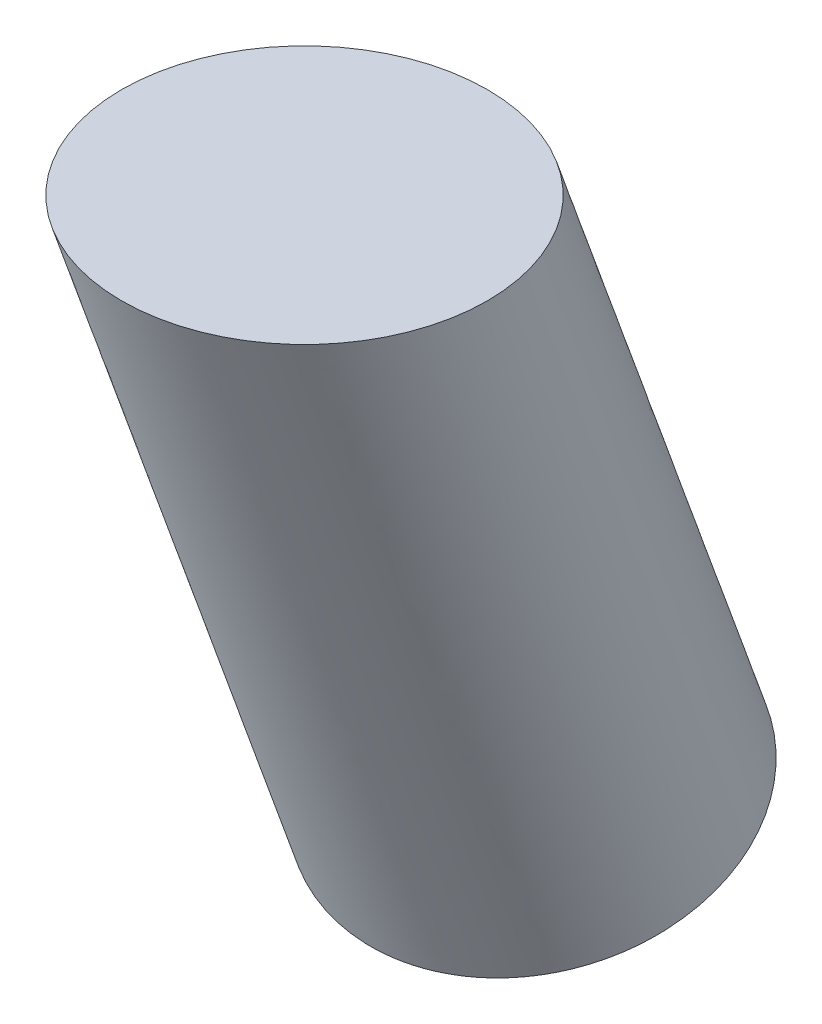
ISO-10303-21;
HEADER;
FILE_DESCRIPTION(('STEP AP214'),'2;1');
FILE_NAME('part.step','',(''),(''),'','','');
FILE_SCHEMA(('AUTOMOTIVE_DESIGN { 1 0 10303 214 1 1 1 1 }'));
ENDSEC;
DATA;
#1=APPLICATION_CONTEXT('core data for automotive mechanical design processes');
#2=APPLICATION_PROTOCOL_DEFINITION('international standard','automotive_design',2000,#1);
#3=PRODUCT_CONTEXT('',#1,'mechanical');
#4=PRODUCT('Part','Part','',(#3));
#5=PRODUCT_RELATED_PRODUCT_CATEGORY('part','',(#4));
#6=PRODUCT_DEFINITION_FORMATION('','',#4);
#7=PRODUCT_DEFINITION_CONTEXT('part definition',#1,'design');
#8=PRODUCT_DEFINITION('design','',#6,#7);
#9=PRODUCT_DEFINITION_SHAPE('','',#8);
#10=(LENGTH_UNIT() NAMED_UNIT(*) SI_UNIT(.MILLI.,.METRE.));
#11=(NAMED_UNIT(*) PLANE_ANGLE_UNIT() SI_UNIT($,.RADIAN.));
#12=(NAMED_UNIT(*) SI_UNIT($,.STERADIAN.) SOLID_ANGLE_UNIT());
#13=UNCERTAINTY_MEASURE_WITH_UNIT(LENGTH_MEASURE(1.E-05),#10,'distance_accuracy_value','');
#14=(GEOMETRIC_REPRESENTATION_CONTEXT(3) GLOBAL_UNCERTAINTY_ASSIGNED_CONTEXT((#13)) GLOBAL_UNIT_ASSIGNED_CONTEXT((#10,
#11,#12)) REPRESENTATION_CONTEXT('',''));
#15=CARTESIAN_POINT('',(0.,0.,0.));
#16=DIRECTION('',(0.,0.,1.));
#17=DIRECTION('',(1.,0.,0.));
#18=AXIS2_PLACEMENT_3D('',#15,#16,#17);
#19=CARTESIAN_POINT('',(76.9622776424513,-1026.07913519455,-144.059681538295));
#20=DIRECTION('',(0.,1.,0.));
#21=DIRECTION('',(-1.,0.,0.));
#22=AXIS2_PLACEMENT_3D('',#19,#20,#21);
#23=CIRCLE('',#22,37.);
#24=DIRECTION('',(0.,-0.939607059285867,-0.342255130188235));
#25=VECTOR('',#24,1.);
#26=SURFACE_OF_LINEAR_EXTRUSION('',#23,#25);
#27=CARTESIAN_POINT('',(39.9622776424512,-1026.07913519455,-144.059681538295));
#28=VERTEX_POINT('',#27);
#29=EDGE_CURVE('E53',#28,#28,#23,.T.);
#30=ORIENTED_EDGE('',*,*,#29,.F.);
#31=EDGE_LOOP('',(#30));
#32=FACE_BOUND('',#31,.T.);
#33=CARTESIAN_POINT('',(39.9622776424512,-1152.47817220577,-190.100969159976));
#34=CARTESIAN_POINT('',(39.9622773598002,-1152.32158281661,-190.530860438408));
#35=CARTESIAN_POINT('',(39.971891724759,-1152.16499252968,-190.960754181516));
#36=CARTESIAN_POINT('',(40.010332933896,-1151.85202860567,-191.819946889993));
#37=CARTESIAN_POINT('',(40.0391671674441,-1151.69565507511,-192.249245562942));
#38=CARTESIAN_POINT('',(40.1157560490168,-1151.38439961296,-193.103747960957));
#39=CARTESIAN_POINT('',(40.1633957731352,-1151.22951436854,-193.528960780877));
#40=CARTESIAN_POINT('',(40.2774863886854,-1150.92055278671,-194.377165695076));
#41=CARTESIAN_POINT('',(40.3439379488668,-1150.76647647826,-194.800157709862));
#42=CARTESIAN_POINT('',(40.4955124939043,-1150.45937476181,-195.643256659274));
#43=CARTESIAN_POINT('',(40.580638590195,-1150.30634953333,-196.063363101081));
#44=CARTESIAN_POINT('',(40.7693666581664,-1150.00161608599,-196.89996034408));
#45=CARTESIAN_POINT('',(40.8729724601477,-1149.84990814702,-197.316450376893));
#46=CARTESIAN_POINT('',(41.2110626635922,-1149.3973078772,-198.558992477951));
#47=CARTESIAN_POINT('',(41.4729099906482,-1149.09875690824,-199.378616709264));
#48=CARTESIAN_POINT('',(42.0672111457387,-1148.51000344579,-200.994945759429));
#49=CARTESIAN_POINT('',(42.3996673809968,-1148.21980123732,-201.791649795826));
#50=CARTESIAN_POINT('',(42.9490177003146,-1147.7921943042,-202.965576663598));
#51=CARTESIAN_POINT('',(43.1406023320465,-1147.65092648363,-203.353405010802));
#52=CARTESIAN_POINT('',(43.5402195730964,-1147.37118767675,-204.121383441246));
#53=CARTESIAN_POINT('',(43.7482480215251,-1147.23271599399,-204.501535436514));
#54=CARTESIAN_POINT('',(44.3964153319114,-1146.82177444644,-205.629710137125));
#55=CARTESIAN_POINT('',(44.8607196387716,-1146.55371320527,-206.365629667052));
#56=CARTESIAN_POINT('',(45.8495713487906,-1146.03117690296,-207.800170029129));
#57=CARTESIAN_POINT('',(46.3740898778655,-1145.77669541507,-208.498808504905));
#58=CARTESIAN_POINT('',(47.4799514529805,-1145.28234936768,-209.85595700287));
#59=CARTESIAN_POINT('',(48.0613337961958,-1145.04249510522,-210.514438756201));
#60=CARTESIAN_POINT('',(49.2829161788718,-1144.57632171364,-211.79424370561));
#61=CARTESIAN_POINT('',(49.9236850809779,-1144.35017732524,-212.415087178848));
#62=CARTESIAN_POINT('',(51.2542796583842,-1143.91530821165,-213.608951208806));
#63=CARTESIAN_POINT('',(51.944124250422,-1143.70659027178,-214.181953137487));
#64=CARTESIAN_POINT('',(53.3682120179188,-1143.30756273642,-215.277419811333));
#65=CARTESIAN_POINT('',(54.1024697102382,-1143.11725921328,-215.79986788582));
#66=CARTESIAN_POINT('',(55.6101788890948,-1142.75601703313,-216.791600872831));
#67=CARTESIAN_POINT('',(56.3836175723717,-1142.58507210859,-217.26090299185));
#68=CARTESIAN_POINT('',(58.0416139319838,-1142.24760493033,-218.187365490161));
#69=CARTESIAN_POINT('',(58.9296894161778,-1142.08310401108,-218.63897661692));
#70=CARTESIAN_POINT('',(60.7405177317638,-1141.77900810034,-219.473823604542));
#71=CARTESIAN_POINT('',(61.6632398985927,-1141.63939168545,-219.857118279902));
#72=CARTESIAN_POINT('',(63.5380821087037,-1141.38545552183,-220.554259654579));
#73=CARTESIAN_POINT('',(64.490206604809,-1141.27113962633,-220.868095775416));
#74=CARTESIAN_POINT('',(66.4178058406479,-1141.06826844458,-221.425046359034));
#75=CARTESIAN_POINT('',(67.393285522904,-1140.97971866414,-221.668145706443));
#76=CARTESIAN_POINT('',(69.3611567926076,-1140.82876396624,-222.082567835636));
#77=CARTESIAN_POINT('',(70.3535451372334,-1140.76635409299,-222.253904222735));
#78=CARTESIAN_POINT('',(72.3493607287534,-1140.66788685723,-222.524230367397));
#79=CARTESIAN_POINT('',(73.3527874151287,-1140.63182816283,-222.623223781427));
#80=CARTESIAN_POINT('',(75.3647441769293,-1140.58618779782,-222.748522149132));
#81=CARTESIAN_POINT('',(76.373274150836,-1140.57660560257,-222.774828543103));
#82=CARTESIAN_POINT('',(78.3895219077611,-1140.58395072884,-222.754663666436));
#83=CARTESIAN_POINT('',(79.3972396813024,-1140.60087835532,-222.708191558547));
#84=CARTESIAN_POINT('',(81.4059274704921,-1140.66118439248,-222.542630919028));
#85=CARTESIAN_POINT('',(82.406897310658,-1140.70456348838,-222.423540506242));
#86=CARTESIAN_POINT('',(84.3960866368778,-1140.81761655827,-222.113171272374));
#87=CARTESIAN_POINT('',(85.3843061547787,-1140.88729046657,-221.921892631635));
#88=CARTESIAN_POINT('',(87.3420817198655,-1141.05268325192,-221.467833028256));
#89=CARTESIAN_POINT('',(88.3116358696014,-1141.14840476205,-221.205044836898));
#90=CARTESIAN_POINT('',(90.2259060540322,-1141.36552018186,-220.60898896178));
#91=CARTESIAN_POINT('',(91.1706221075092,-1141.48691407213,-220.275721331319));
#92=CARTESIAN_POINT('',(93.0292387004357,-1141.75490377964,-219.539998185686));
#93=CARTESIAN_POINT('',(93.9431341285232,-1141.90150375277,-219.137531261185));
#94=CARTESIAN_POINT('',(95.7337562106525,-1142.21926110046,-218.265178969883));
#95=CARTESIAN_POINT('',(96.6104827810266,-1142.3904185303,-217.795293451332));
#96=CARTESIAN_POINT('',(98.3207274879757,-1142.75654520461,-216.790150861985));
#97=CARTESIAN_POINT('',(99.15423560645,-1142.95151993513,-216.254878730119));
#98=CARTESIAN_POINT('',(100.771572740079,-1143.36428720422,-215.121691801206));
#99=CARTESIAN_POINT('',(101.555402429853,-1143.58207943283,-214.523777855111));
#100=CARTESIAN_POINT('',(103.050714245338,-1144.0343435523,-213.282158601433));
#101=CARTESIAN_POINT('',(103.763399496719,-1144.26834938044,-212.639732794933));
#102=CARTESIAN_POINT('',(105.12956977243,-1144.75580755257,-211.301493863677));
#103=CARTESIAN_POINT('',(105.783056895075,-1145.0092592067,-210.605682632818));
#104=CARTESIAN_POINT('',(107.007073032715,-1145.52641194651,-209.185921985883));
#105=CARTESIAN_POINT('',(107.579471826837,-1145.7895950714,-208.463394548823));
#106=CARTESIAN_POINT('',(108.658518086372,-1146.3313609595,-206.976062415464));
#107=CARTESIAN_POINT('',(109.165167676669,-1146.60994322462,-206.211259086577));
#108=CARTESIAN_POINT('',(109.866415331607,-1147.03436831855,-205.046067452546));
#109=CARTESIAN_POINT('',(110.087884108502,-1147.17508273438,-204.659758390105));
#110=CARTESIAN_POINT('',(110.513649206464,-1147.45952153019,-203.878876887103));
#111=CARTESIAN_POINT('',(110.717946756613,-1147.60324569381,-203.484305040505));
#112=CARTESIAN_POINT('',(111.108889147187,-1147.89345799092,-202.687573307346));
#113=CARTESIAN_POINT('',(111.295536177611,-1148.0399457788,-202.285414369605));
#114=CARTESIAN_POINT('',(111.650827044383,-1148.33549166447,-201.474040116813));
#115=CARTESIAN_POINT('',(111.819466253354,-1148.48455041153,-201.06482301929));
#116=CARTESIAN_POINT('',(112.291753688652,-1148.92955646536,-199.843129631175));
#117=CARTESIAN_POINT('',(112.569156512424,-1149.22882226071,-199.021542957638));
#118=CARTESIAN_POINT('',(113.050336746121,-1149.83420549171,-197.359559521152));
#119=CARTESIAN_POINT('',(113.254116506783,-1150.14032270827,-196.519163359689));
#120=CARTESIAN_POINT('',(113.502334274417,-1150.60146069153,-195.253182323463));
#121=CARTESIAN_POINT('',(113.57527648636,-1150.75473651504,-194.832387912838));
#122=CARTESIAN_POINT('',(113.702499764015,-1151.06215463969,-193.988420315008));
#123=CARTESIAN_POINT('',(113.756785379329,-1151.21629672024,-193.565247733364));
#124=CARTESIAN_POINT('',(113.891456261716,-1151.67963730209,-192.293219812794));
#125=CARTESIAN_POINT('',(113.943706618821,-1151.98984497794,-191.44159394553));
#126=CARTESIAN_POINT('',(113.972558102186,-1152.61028852444,-189.738264806654));
#127=CARTESIAN_POINT('',(113.949252612374,-1152.92052388675,-188.88656293062));
#128=CARTESIAN_POINT('',(113.85790886255,-1153.38463476705,-187.612420278061));
#129=CARTESIAN_POINT('',(113.818028626833,-1153.53920985233,-187.18805895079));
#130=CARTESIAN_POINT('',(113.719543340784,-1153.84768527305,-186.341188714623));
#131=CARTESIAN_POINT('',(113.660935097598,-1154.00158548891,-185.918680134056));
#132=CARTESIAN_POINT('',(113.455401899699,-1154.46589240094,-184.643999307579));
#133=CARTESIAN_POINT('',(113.279561406419,-1154.7748581269,-183.79578301634));
#134=CARTESIAN_POINT('',(112.853043575805,-1155.38677544981,-182.115861269093));
#135=CARTESIAN_POINT('',(112.602332991008,-1155.68972431099,-181.284163323724));
#136=CARTESIAN_POINT('',(112.02840133534,-1156.28747132218,-179.643143914983));
#137=CARTESIAN_POINT('',(111.705180333592,-1156.58226947996,-178.833822430279));
#138=CARTESIAN_POINT('',(110.989271961252,-1157.16166281298,-177.243190127679));
#139=CARTESIAN_POINT('',(110.596612458341,-1157.44626202645,-176.461868223461));
#140=CARTESIAN_POINT('',(109.743743984349,-1158.00451796916,-174.929265266233));
#141=CARTESIAN_POINT('',(109.283319653017,-1158.27813613475,-174.178090083543));
#142=CARTESIAN_POINT('',(108.299844484128,-1158.81174498337,-172.713151805529));
#143=CARTESIAN_POINT('',(107.776809530023,-1159.07173909867,-171.999379287446));
#144=CARTESIAN_POINT('',(106.665599734388,-1159.57972183353,-170.604793431545));
#145=CARTESIAN_POINT('',(106.076723204676,-1159.82753056598,-169.924473945193));
#146=CARTESIAN_POINT('',(104.843341252199,-1160.30652408637,-168.609473369879));
#147=CARTESIAN_POINT('',(104.198813723929,-1160.53770220087,-167.974810601731));
#148=CARTESIAN_POINT('',(102.858705269408,-1160.98227939538,-166.754294578697));
#149=CARTESIAN_POINT('',(102.16309571705,-1161.19566836121,-166.168469090684));
#150=CARTESIAN_POINT('',(100.726287510142,-1161.60343388136,-165.049013668485));
#151=CARTESIAN_POINT('',(99.9851047922493,-1161.797817021,-164.515365655347));
#152=CARTESIAN_POINT('',(98.4125030819676,-1162.1787474886,-163.469581604543));
#153=CARTESIAN_POINT('',(97.5783486609051,-1162.36397297207,-162.961074480826));
#154=CARTESIAN_POINT('',(95.8704381407354,-1162.7109596171,-162.008477799593));
#155=CARTESIAN_POINT('',(94.9967184528033,-1162.87274179942,-161.564330532942));
#156=CARTESIAN_POINT('',(93.2146852213907,-1163.17237364414,-160.741738929044));
#157=CARTESIAN_POINT('',(92.3063634810596,-1163.3102175923,-160.363310279332));
#158=CARTESIAN_POINT('',(90.46118794384,-1163.56136310088,-159.673830204504));
#159=CARTESIAN_POINT('',(89.5243331124304,-1163.67466377023,-159.36278122569));
#160=CARTESIAN_POINT('',(87.6284558009812,-1163.87622418254,-158.809429151253));
#161=CARTESIAN_POINT('',(86.6694451376122,-1163.96449695509,-158.56709028495));
#162=CARTESIAN_POINT('',(84.7338510295521,-1164.1158091268,-158.151686768253));
#163=CARTESIAN_POINT('',(83.7572551898935,-1164.17882993635,-157.978673152635));
#164=CARTESIAN_POINT('',(81.7818701800528,-1164.27988500633,-157.70124252046));
#165=CARTESIAN_POINT('',(80.7829549390907,-1164.31763061537,-157.597617950418));
#166=CARTESIAN_POINT('',(78.7792396176416,-1164.36686779083,-157.462445111329));
#167=CARTESIAN_POINT('',(77.7744374317257,-1164.37834930635,-157.430924435441));
#168=CARTESIAN_POINT('',(75.7650740646754,-1164.37498784926,-157.440152781575));
#169=CARTESIAN_POINT('',(74.7605129309537,-1164.36014150158,-157.480911069347));
#170=CARTESIAN_POINT('',(72.7580360230659,-1164.30418207366,-157.634538784068));
#171=CARTESIAN_POINT('',(71.7601179793753,-1164.26307848416,-157.747382155732));
#172=CARTESIAN_POINT('',(69.6918141383377,-1164.1501355334,-158.057449075026));
#173=CARTESIAN_POINT('',(68.6225032411504,-1164.07597458685,-158.261046166073));
#174=CARTESIAN_POINT('',(66.5067096933679,-1163.8972887162,-158.75159982223));
#175=CARTESIAN_POINT('',(65.4602086282192,-1163.79278934051,-159.038486248259));
#176=CARTESIAN_POINT('',(63.4273052693182,-1163.55741409467,-159.684671573371));
#177=CARTESIAN_POINT('',(62.4400409377755,-1163.42741023515,-160.041576505888));
#178=CARTESIAN_POINT('',(60.5002280051593,-1163.13978940817,-160.831193769718));
#179=CARTESIAN_POINT('',(59.547685114804,-1162.9821679229,-161.263918503941));
#180=CARTESIAN_POINT('',(57.7090608389943,-1162.64456660365,-162.190749265014));
#181=CARTESIAN_POINT('',(56.8218922329878,-1162.46528037278,-162.682951114752));
#182=CARTESIAN_POINT('',(55.0941223797148,-1162.08213804274,-163.734807482297));
#183=CARTESIAN_POINT('',(54.2535167821113,-1161.87828424457,-164.294455683087));
#184=CARTESIAN_POINT('',(52.6497235793185,-1161.45349505121,-165.460646894238));
#185=CARTESIAN_POINT('',(51.8849751971207,-1161.23324994509,-166.06529482565));
#186=CARTESIAN_POINT('',(50.4114515876157,-1160.7717776666,-167.332193616293));
#187=CARTESIAN_POINT('',(49.7026786338775,-1160.53054964281,-167.994446812999));
#188=CARTESIAN_POINT('',(48.3673077255634,-1160.03599910653,-169.352156702716));
#189=CARTESIAN_POINT('',(47.7388875839658,-1159.78325308348,-170.046030735617));
#190=CARTESIAN_POINT('',(46.5457071232972,-1159.26086037192,-171.480176892113));
#191=CARTESIAN_POINT('',(45.9809259500603,-1158.99121926518,-172.220433691851));
#192=CARTESIAN_POINT('',(44.9342131655796,-1158.44418710187,-173.722223546741));
#193=CARTESIAN_POINT('',(44.4504336137363,-1158.16721164535,-174.482615638006));
#194=CARTESIAN_POINT('',(43.7762199913854,-1157.7420723258,-175.649768064945));
#195=CARTESIAN_POINT('',(43.5599344731471,-1157.59865032721,-176.043510365481));
#196=CARTESIAN_POINT('',(43.1450381357993,-1157.30881290498,-176.839212939253));
#197=CARTESIAN_POINT('',(42.9464302734444,-1157.16239698559,-177.241174573476));
#198=CARTESIAN_POINT('',(42.3806926722242,-1156.72123711888,-178.452308866199));
#199=CARTESIAN_POINT('',(42.0402268573089,-1156.42242358984,-179.272653914484));
#200=CARTESIAN_POINT('',(41.4340130192536,-1155.81591567683,-180.937724986637));
#201=CARTESIAN_POINT('',(41.1683011784772,-1155.5082170715,-181.782462599614));
#202=CARTESIAN_POINT('',(40.7145021522385,-1154.88649552146,-183.489300294054));
#203=CARTESIAN_POINT('',(40.5263412346131,-1154.57247888306,-184.351383062578));
#204=CARTESIAN_POINT('',(40.2292287531192,-1153.94025029214,-186.08706616772));
#205=CARTESIAN_POINT('',(40.1202240650924,-1153.62204129953,-186.96065837837));
#206=CARTESIAN_POINT('',(40.0216061550145,-1153.16565118729,-188.213604889387));
#207=CARTESIAN_POINT('',(39.9993548399127,-1153.02821846085,-188.59090459521));
#208=CARTESIAN_POINT('',(39.9696956085288,-1152.75324803612,-189.345792190419));
#209=CARTESIAN_POINT('',(39.9622778907139,-1152.61571046725,-189.723379724479));
#210=CARTESIAN_POINT('',(39.9622776424512,-1152.47817220577,-190.100969159976));
#211=B_SPLINE_CURVE_WITH_KNOTS('',3,(#33,#34,#35,#36,#37,#38,#39,#40,#41,#42,#43,#44,#45,#46,
#47,#48,#49,#50,#51,#52,#53,#54,#55,#56,#57,#58,#59,#60,#61,#62,#63,#64,#65,#66,#67,#68,#69,#70,
#71,#72,#73,#74,#75,#76,#77,#78,#79,#80,#81,#82,#83,#84,#85,#86,#87,#88,#89,#90,#91,#92,#93,#94,
#95,#96,#97,#98,#99,#100,#101,#102,#103,#104,#105,#106,#107,#108,#109,#110,#111,#112,#113,#114,
#115,#116,#117,#118,#119,#120,#121,#122,#123,#124,#125,#126,#127,#128,#129,#130,#131,#132,#133,
#134,#135,#136,#137,#138,#139,#140,#141,#142,#143,#144,#145,#146,#147,#148,#149,#150,#151,#152,
#153,#154,#155,#156,#157,#158,#159,#160,#161,#162,#163,#164,#165,#166,#167,#168,#169,#170,#171,
#172,#173,#174,#175,#176,#177,#178,#179,#180,#181,#182,#183,#184,#185,#186,#187,#188,#189,#190,
#191,#192,#193,#194,#195,#196,#197,#198,#199,#200,#201,#202,#203,#204,#205,#206,#207,#208,#209,
#210),.UNSPECIFIED.,.T.,.F.,(4,2,2,2,2,2,2,2,2,2,2,2,2,2,2,2,2,2,2,2,2,2,2,2,2,2,2,2,2,2,2,2,2,
2,2,2,2,2,2,2,2,2,2,2,2,2,2,2,2,2,2,2,2,2,2,2,2,2,2,2,2,2,2,2,2,2,2,2,2,2,2,2,2,2,2,2,2,2,2,2,2,
2,2,2,2,2,2,2,4),(0.,1.37247087810684,2.74546972803802,4.11020468926403,5.4749881721129,
6.83999921960911,8.20529352330754,10.9342675053411,13.663334539448,15.0281641828451,
16.3926495730206,19.1210007954939,21.8480491340011,24.5769955660465,27.3354998347922,
30.0950732201092,32.8555535251816,35.6151375285592,38.6412178749279,41.6646803127138,
44.6886029049643,47.7131711897564,50.7371657962753,53.7610075489298,56.7847893836217,
59.8086060044614,62.8325009597062,65.8563883605683,68.8805815521406,71.9047724567947,
74.9294624580807,77.954159267619,80.9795541003529,84.004907840211,86.9644311365147,
89.9238494895463,92.7965490173788,95.6691556821467,97.0698146402841,98.4703732565973,
99.870757869158,101.271501469778,104.020188633782,106.768788026229,108.129673293939,
109.490226459886,112.210490205178,114.927393098441,116.287231755667,117.64730236953,
120.402887011935,123.159697147418,125.916504654943,128.672208276324,131.436866744997,
134.200825338357,136.99770601741,139.795702820561,142.595279751637,145.39388319506,
148.373654852007,151.35073790026,154.328530626996,157.306431448051,160.282779106899,
163.261313838907,166.27330932844,169.286457274074,172.299991515949,175.312437126232,
178.581704346184,181.848226418135,185.018088707721,188.188470021082,191.275827037428,
194.362895116761,197.357944578513,200.353115628488,203.258820994074,206.163571388502,
208.988626487482,210.402990579904,211.817590795246,214.625341386766,217.434448654709,
220.240878945837,223.045424010935,224.251713365803,225.457205382275),.UNSPECIFIED.);
#212=CARTESIAN_POINT('',(39.9622776424512,-1152.47817220577,-190.100969159976));
#213=VERTEX_POINT('',#212);
#214=EDGE_CURVE('E10',#213,#213,#211,.T.);
#215=ORIENTED_EDGE('',*,*,#214,.F.);
#216=EDGE_LOOP('',(#215));
#217=FACE_BOUND('',#216,.T.);
#218=ADVANCED_FACE('F41',(#32,#217),#26,.F.);
#219=CARTESIAN_POINT('',(60.1848858182007,-1026.07913519426,-70.6947678310846));
#220=DIRECTION('',(0.,-1.,0.));
#221=DIRECTION('',(0.,0.,-1.));
#222=AXIS2_PLACEMENT_3D('',#219,#220,#221);
#223=PLANE('',#222);
#224=ORIENTED_EDGE('',*,*,#29,.T.);
#225=EDGE_LOOP('',(#224));
#226=FACE_BOUND('',#225,.T.);
#227=ADVANCED_FACE('F64',(#226),#223,.F.);
#228=CARTESIAN_POINT('',(109.855142603676,-1148.80439481903,-200.18674103701));
#229=DIRECTION('',(0.,-0.939607059285866,-0.342255130188236));
#230=DIRECTION('',(0.310232127508018,-0.325368548542428,0.893247633459637));
#231=AXIS2_PLACEMENT_3D('',#228,#229,#230);
#232=PLANE('',#231);
#233=ORIENTED_EDGE('',*,*,#214,.T.);
#234=EDGE_LOOP('',(#233));
#235=FACE_BOUND('',#234,.T.);
#236=ADVANCED_FACE('F43',(#235),#232,.T.);
#237=CLOSED_SHELL('',(#218,#227,#236));
#238=MANIFOLD_SOLID_BREP('B2',#237);
#239=ADVANCED_BREP_SHAPE_REPRESENTATION('',(#18,#238),#14);
#240=SHAPE_DEFINITION_REPRESENTATION(#9,#239);
ENDSEC;
END-ISO-10303-21;
